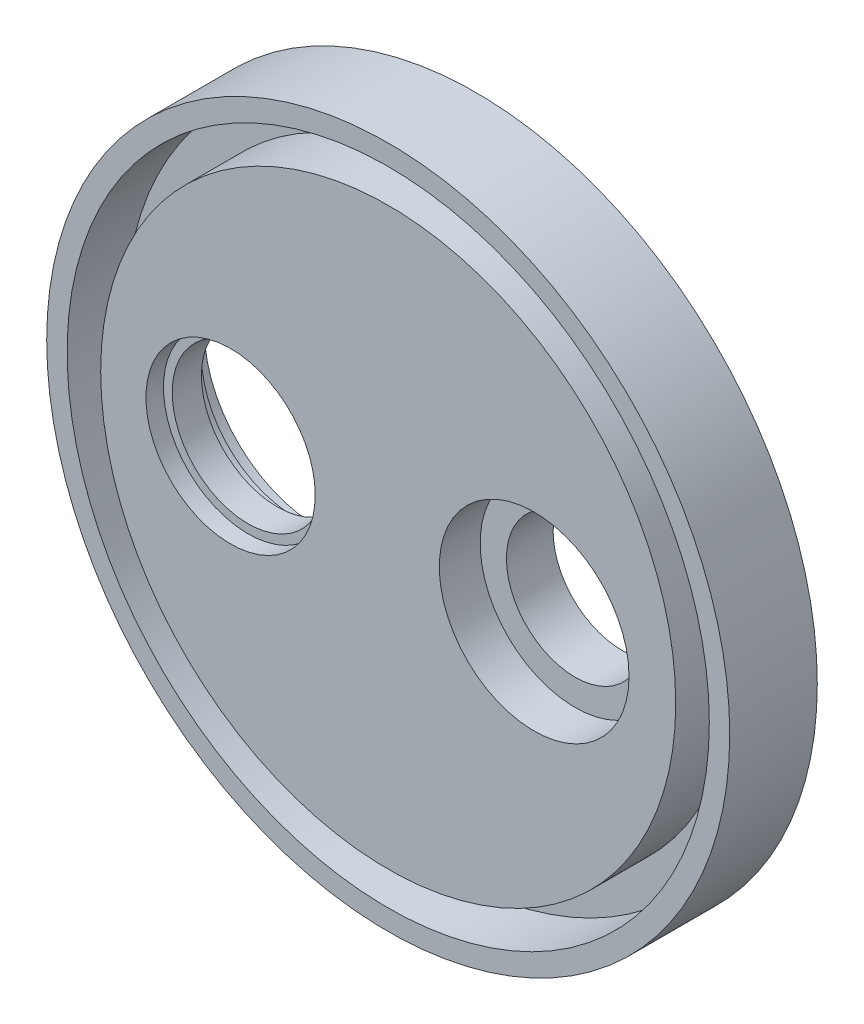
ISO-10303-21;
HEADER;
FILE_DESCRIPTION(('STEP AP214'),'2;1');
FILE_NAME('part.step','',(''),(''),'','','');
FILE_SCHEMA(('AUTOMOTIVE_DESIGN { 1 0 10303 214 1 1 1 1 }'));
ENDSEC;
DATA;
#1=APPLICATION_CONTEXT('core data for automotive mechanical design processes');
#2=APPLICATION_PROTOCOL_DEFINITION('international standard','automotive_design',2000,#1);
#3=PRODUCT_CONTEXT('',#1,'mechanical');
#4=PRODUCT('Part','Part','',(#3));
#5=PRODUCT_RELATED_PRODUCT_CATEGORY('part','',(#4));
#6=PRODUCT_DEFINITION_FORMATION('','',#4);
#7=PRODUCT_DEFINITION_CONTEXT('part definition',#1,'design');
#8=PRODUCT_DEFINITION('design','',#6,#7);
#9=PRODUCT_DEFINITION_SHAPE('','',#8);
#10=(LENGTH_UNIT() NAMED_UNIT(*) SI_UNIT(.MILLI.,.METRE.));
#11=(NAMED_UNIT(*) PLANE_ANGLE_UNIT() SI_UNIT($,.RADIAN.));
#12=(NAMED_UNIT(*) SI_UNIT($,.STERADIAN.) SOLID_ANGLE_UNIT());
#13=UNCERTAINTY_MEASURE_WITH_UNIT(LENGTH_MEASURE(1.E-05),#10,'distance_accuracy_value','');
#14=(GEOMETRIC_REPRESENTATION_CONTEXT(3) GLOBAL_UNCERTAINTY_ASSIGNED_CONTEXT((#13)) GLOBAL_UNIT_ASSIGNED_CONTEXT((#10,
#11,#12)) REPRESENTATION_CONTEXT('',''));
#15=CARTESIAN_POINT('',(0.,0.,0.));
#16=DIRECTION('',(0.,0.,1.));
#17=DIRECTION('',(1.,0.,0.));
#18=AXIS2_PLACEMENT_3D('',#15,#16,#17);
#19=CARTESIAN_POINT('',(25.,0.,15.));
#20=DIRECTION('',(0.,0.,-1.));
#21=DIRECTION('',(-1.,0.,0.));
#22=AXIS2_PLACEMENT_3D('',#19,#20,#21);
#23=CYLINDRICAL_SURFACE('',#22,11.75);
#24=CARTESIAN_POINT('',(25.,0.,0.));
#25=DIRECTION('',(0.,0.,-1.));
#26=DIRECTION('',(-1.,0.,0.));
#27=AXIS2_PLACEMENT_3D('',#24,#25,#26);
#28=CIRCLE('',#27,11.75);
#29=CARTESIAN_POINT('',(13.25,0.,0.));
#30=VERTEX_POINT('',#29);
#31=EDGE_CURVE('E53',#30,#30,#28,.T.);
#32=ORIENTED_EDGE('',*,*,#31,.T.);
#33=EDGE_LOOP('',(#32));
#34=FACE_BOUND('',#33,.T.);
#35=CARTESIAN_POINT('',(25.,0.,8.));
#36=DIRECTION('',(0.,0.,1.));
#37=DIRECTION('',(1.,0.,0.));
#38=AXIS2_PLACEMENT_3D('',#35,#36,#37);
#39=CIRCLE('',#38,11.75);
#40=CARTESIAN_POINT('',(36.75,0.,8.));
#41=VERTEX_POINT('',#40);
#42=EDGE_CURVE('E51',#41,#41,#39,.F.);
#43=ORIENTED_EDGE('',*,*,#42,.F.);
#44=EDGE_LOOP('',(#43));
#45=FACE_BOUND('',#44,.T.);
#46=ADVANCED_FACE('F33',(#34,#45),#23,.F.);
#47=CARTESIAN_POINT('',(0.,0.,15.));
#48=DIRECTION('',(0.,0.,-1.));
#49=DIRECTION('',(-1.,0.,0.));
#50=AXIS2_PLACEMENT_3D('',#47,#48,#49);
#51=CYLINDRICAL_SURFACE('',#50,58.5);
#52=CARTESIAN_POINT('',(0.,0.,15.));
#53=DIRECTION('',(0.,0.,1.));
#54=DIRECTION('',(1.,0.,0.));
#55=AXIS2_PLACEMENT_3D('',#52,#53,#54);
#56=CIRCLE('',#55,58.5);
#57=CARTESIAN_POINT('',(58.5,0.,15.));
#58=VERTEX_POINT('',#57);
#59=EDGE_CURVE('E10',#58,#58,#56,.T.);
#60=ORIENTED_EDGE('',*,*,#59,.F.);
#61=EDGE_LOOP('',(#60));
#62=FACE_BOUND('',#61,.T.);
#63=CARTESIAN_POINT('',(0.,0.,0.));
#64=DIRECTION('',(0.,0.,1.));
#65=DIRECTION('',(1.,0.,0.));
#66=AXIS2_PLACEMENT_3D('',#63,#64,#65);
#67=CIRCLE('',#66,58.5);
#68=CARTESIAN_POINT('',(58.5,0.,0.));
#69=VERTEX_POINT('',#68);
#70=EDGE_CURVE('E41',#69,#69,#67,.T.);
#71=ORIENTED_EDGE('',*,*,#70,.T.);
#72=EDGE_LOOP('',(#71));
#73=FACE_BOUND('',#72,.T.);
#74=ADVANCED_FACE('F35',(#62,#73),#51,.T.);
#75=CARTESIAN_POINT('',(0.,0.,15.));
#76=DIRECTION('',(0.,0.,1.));
#77=DIRECTION('',(1.,0.,0.));
#78=AXIS2_PLACEMENT_3D('',#75,#76,#77);
#79=PLANE('',#78);
#80=CARTESIAN_POINT('',(0.,0.,15.));
#81=DIRECTION('',(0.,0.,1.));
#82=DIRECTION('',(1.,0.,0.));
#83=AXIS2_PLACEMENT_3D('',#80,#81,#82);
#84=CIRCLE('',#83,55.);
#85=CARTESIAN_POINT('',(55.,0.,15.));
#86=VERTEX_POINT('',#85);
#87=EDGE_CURVE('E49',#86,#86,#84,.T.);
#88=ORIENTED_EDGE('',*,*,#87,.F.);
#89=EDGE_LOOP('',(#88));
#90=FACE_BOUND('',#89,.T.);
#91=ORIENTED_EDGE('',*,*,#59,.T.);
#92=EDGE_LOOP('',(#91));
#93=FACE_BOUND('',#92,.T.);
#94=ADVANCED_FACE('F84',(#90,#93),#79,.T.);
#95=CARTESIAN_POINT('',(0.,0.,0.));
#96=DIRECTION('',(0.,0.,1.));
#97=DIRECTION('',(1.,0.,0.));
#98=AXIS2_PLACEMENT_3D('',#95,#96,#97);
#99=PLANE('',#98);
#100=CARTESIAN_POINT('',(-27.,0.,0.));
#101=DIRECTION('',(0.,0.,-1.));
#102=DIRECTION('',(-1.,0.,0.));
#103=AXIS2_PLACEMENT_3D('',#100,#101,#102);
#104=CIRCLE('',#103,19.5);
#105=CARTESIAN_POINT('',(-46.5,0.,0.));
#106=VERTEX_POINT('',#105);
#107=EDGE_CURVE('E69',#106,#106,#104,.T.);
#108=ORIENTED_EDGE('',*,*,#107,.F.);
#109=EDGE_LOOP('',(#108));
#110=FACE_BOUND('',#109,.T.);
#111=ORIENTED_EDGE('',*,*,#31,.F.);
#112=EDGE_LOOP('',(#111));
#113=FACE_BOUND('',#112,.T.);
#114=ORIENTED_EDGE('',*,*,#70,.F.);
#115=EDGE_LOOP('',(#114));
#116=FACE_BOUND('',#115,.T.);
#117=ADVANCED_FACE('F86',(#110,#113,#116),#99,.F.);
#118=CARTESIAN_POINT('',(0.,0.,5.));
#119=DIRECTION('',(0.,0.,1.));
#120=DIRECTION('',(1.,0.,0.));
#121=AXIS2_PLACEMENT_3D('',#118,#119,#120);
#122=CYLINDRICAL_SURFACE('',#121,55.);
#123=CARTESIAN_POINT('',(0.,0.,5.));
#124=DIRECTION('',(0.,0.,1.));
#125=DIRECTION('',(1.,0.,0.));
#126=AXIS2_PLACEMENT_3D('',#123,#124,#125);
#127=CIRCLE('',#126,55.);
#128=CARTESIAN_POINT('',(55.,0.,5.));
#129=VERTEX_POINT('',#128);
#130=EDGE_CURVE('E46',#129,#129,#127,.T.);
#131=ORIENTED_EDGE('',*,*,#130,.F.);
#132=EDGE_LOOP('',(#131));
#133=FACE_BOUND('',#132,.T.);
#134=ORIENTED_EDGE('',*,*,#87,.T.);
#135=EDGE_LOOP('',(#134));
#136=FACE_BOUND('',#135,.T.);
#137=ADVANCED_FACE('F82',(#133,#136),#122,.F.);
#138=CARTESIAN_POINT('',(0.,0.,5.));
#139=DIRECTION('',(0.,0.,1.));
#140=DIRECTION('',(1.,0.,0.));
#141=AXIS2_PLACEMENT_3D('',#138,#139,#140);
#142=PLANE('',#141);
#143=CARTESIAN_POINT('',(0.,0.,5.));
#144=DIRECTION('',(0.,0.,1.));
#145=DIRECTION('',(1.,0.,0.));
#146=AXIS2_PLACEMENT_3D('',#143,#144,#145);
#147=CIRCLE('',#146,49.25);
#148=CARTESIAN_POINT('',(49.25,0.,5.));
#149=VERTEX_POINT('',#148);
#150=EDGE_CURVE('E72',#149,#149,#147,.T.);
#151=ORIENTED_EDGE('',*,*,#150,.F.);
#152=EDGE_LOOP('',(#151));
#153=FACE_BOUND('',#152,.T.);
#154=ORIENTED_EDGE('',*,*,#130,.T.);
#155=EDGE_LOOP('',(#154));
#156=FACE_BOUND('',#155,.T.);
#157=ADVANCED_FACE('F112',(#153,#156),#142,.T.);
#158=CARTESIAN_POINT('',(0.,0.,5.));
#159=DIRECTION('',(0.,0.,1.));
#160=DIRECTION('',(1.,0.,0.));
#161=AXIS2_PLACEMENT_3D('',#158,#159,#160);
#162=CYLINDRICAL_SURFACE('',#161,49.25);
#163=ORIENTED_EDGE('',*,*,#150,.T.);
#164=EDGE_LOOP('',(#163));
#165=FACE_BOUND('',#164,.T.);
#166=CARTESIAN_POINT('',(0.,0.,15.));
#167=DIRECTION('',(0.,0.,1.));
#168=DIRECTION('',(1.,0.,0.));
#169=AXIS2_PLACEMENT_3D('',#166,#167,#168);
#170=CIRCLE('',#169,49.25);
#171=CARTESIAN_POINT('',(49.25,0.,15.));
#172=VERTEX_POINT('',#171);
#173=EDGE_CURVE('E58',#172,#172,#170,.T.);
#174=ORIENTED_EDGE('',*,*,#173,.F.);
#175=EDGE_LOOP('',(#174));
#176=FACE_BOUND('',#175,.T.);
#177=ADVANCED_FACE('F98',(#165,#176),#162,.T.);
#178=CARTESIAN_POINT('',(-27.,0.,15.));
#179=DIRECTION('',(0.,0.,1.));
#180=DIRECTION('',(1.,0.,0.));
#181=AXIS2_PLACEMENT_3D('',#178,#179,#180);
#182=CIRCLE('',#181,14.5);
#183=CARTESIAN_POINT('',(-12.5,0.,15.));
#184=VERTEX_POINT('',#183);
#185=EDGE_CURVE('E254',#184,#184,#182,.T.);
#186=ORIENTED_EDGE('',*,*,#185,.F.);
#187=EDGE_LOOP('',(#186));
#188=FACE_BOUND('',#187,.T.);
#189=CARTESIAN_POINT('',(25.,0.,15.));
#190=DIRECTION('',(0.,0.,1.));
#191=DIRECTION('',(1.,0.,0.));
#192=AXIS2_PLACEMENT_3D('',#189,#190,#191);
#193=CIRCLE('',#192,16.25);
#194=CARTESIAN_POINT('',(41.25,0.,15.));
#195=VERTEX_POINT('',#194);
#196=EDGE_CURVE('E61',#195,#195,#193,.T.);
#197=ORIENTED_EDGE('',*,*,#196,.F.);
#198=EDGE_LOOP('',(#197));
#199=FACE_BOUND('',#198,.T.);
#200=ORIENTED_EDGE('',*,*,#173,.T.);
#201=EDGE_LOOP('',(#200));
#202=FACE_BOUND('',#201,.T.);
#203=ADVANCED_FACE('F88',(#188,#199,#202),#79,.T.);
#204=CARTESIAN_POINT('',(25.,0.,8.));
#205=DIRECTION('',(0.,0.,1.));
#206=DIRECTION('',(1.,0.,0.));
#207=AXIS2_PLACEMENT_3D('',#204,#205,#206);
#208=PLANE('',#207);
#209=CARTESIAN_POINT('',(25.,0.,8.));
#210=DIRECTION('',(0.,0.,1.));
#211=DIRECTION('',(1.,0.,0.));
#212=AXIS2_PLACEMENT_3D('',#209,#210,#211);
#213=CIRCLE('',#212,16.25);
#214=CARTESIAN_POINT('',(41.25,0.,8.));
#215=VERTEX_POINT('',#214);
#216=EDGE_CURVE('E54',#215,#215,#213,.T.);
#217=ORIENTED_EDGE('',*,*,#216,.T.);
#218=EDGE_LOOP('',(#217));
#219=FACE_BOUND('',#218,.T.);
#220=ORIENTED_EDGE('',*,*,#42,.T.);
#221=EDGE_LOOP('',(#220));
#222=FACE_BOUND('',#221,.T.);
#223=ADVANCED_FACE('F97',(#219,#222),#208,.T.);
#224=CARTESIAN_POINT('',(25.,0.,8.));
#225=DIRECTION('',(0.,0.,1.));
#226=DIRECTION('',(1.,0.,0.));
#227=AXIS2_PLACEMENT_3D('',#224,#225,#226);
#228=CYLINDRICAL_SURFACE('',#227,16.25);
#229=ORIENTED_EDGE('',*,*,#216,.F.);
#230=EDGE_LOOP('',(#229));
#231=FACE_BOUND('',#230,.T.);
#232=ORIENTED_EDGE('',*,*,#196,.T.);
#233=EDGE_LOOP('',(#232));
#234=FACE_BOUND('',#233,.T.);
#235=ADVANCED_FACE('F108',(#231,#234),#228,.F.);
#236=CARTESIAN_POINT('',(-27.,0.,4.));
#237=DIRECTION('',(0.,0.,-1.));
#238=DIRECTION('',(-1.,0.,0.));
#239=AXIS2_PLACEMENT_3D('',#236,#237,#238);
#240=CYLINDRICAL_SURFACE('',#239,19.5);
#241=CARTESIAN_POINT('',(-27.,0.,4.));
#242=DIRECTION('',(0.,0.,-1.));
#243=DIRECTION('',(-1.,0.,0.));
#244=AXIS2_PLACEMENT_3D('',#241,#242,#243);
#245=CIRCLE('',#244,19.5);
#246=CARTESIAN_POINT('',(-46.5,0.,4.));
#247=VERTEX_POINT('',#246);
#248=EDGE_CURVE('E66',#247,#247,#245,.T.);
#249=ORIENTED_EDGE('',*,*,#248,.F.);
#250=EDGE_LOOP('',(#249));
#251=FACE_BOUND('',#250,.T.);
#252=ORIENTED_EDGE('',*,*,#107,.T.);
#253=EDGE_LOOP('',(#252));
#254=FACE_BOUND('',#253,.T.);
#255=ADVANCED_FACE('F147',(#251,#254),#240,.F.);
#256=CARTESIAN_POINT('',(-27.,0.,4.));
#257=DIRECTION('',(0.,0.,-1.));
#258=DIRECTION('',(-1.,0.,0.));
#259=AXIS2_PLACEMENT_3D('',#256,#257,#258);
#260=PLANE('',#259);
#261=CARTESIAN_POINT('',(-27.,0.,4.));
#262=DIRECTION('',(0.,0.,-1.));
#263=DIRECTION('',(-1.,0.,0.));
#264=AXIS2_PLACEMENT_3D('',#261,#262,#263);
#265=CIRCLE('',#264,16.);
#266=CARTESIAN_POINT('',(-43.,0.,4.));
#267=VERTEX_POINT('',#266);
#268=EDGE_CURVE('E259',#267,#267,#265,.T.);
#269=ORIENTED_EDGE('',*,*,#268,.F.);
#270=EDGE_LOOP('',(#269));
#271=FACE_BOUND('',#270,.T.);
#272=ORIENTED_EDGE('',*,*,#248,.T.);
#273=EDGE_LOOP('',(#272));
#274=FACE_BOUND('',#273,.T.);
#275=ADVANCED_FACE('F154',(#271,#274),#260,.T.);
#276=CARTESIAN_POINT('',(-27.,0.,7.));
#277=DIRECTION('',(0.,0.,-1.));
#278=DIRECTION('',(-1.,0.,0.));
#279=AXIS2_PLACEMENT_3D('',#276,#277,#278);
#280=CYLINDRICAL_SURFACE('',#279,16.);
#281=CARTESIAN_POINT('',(-27.,0.,7.));
#282=DIRECTION('',(0.,0.,-1.));
#283=DIRECTION('',(-1.,0.,0.));
#284=AXIS2_PLACEMENT_3D('',#281,#282,#283);
#285=CIRCLE('',#284,16.);
#286=CARTESIAN_POINT('',(-43.,0.,7.));
#287=VERTEX_POINT('',#286);
#288=EDGE_CURVE('E262',#287,#287,#285,.T.);
#289=ORIENTED_EDGE('',*,*,#288,.F.);
#290=EDGE_LOOP('',(#289));
#291=FACE_BOUND('',#290,.T.);
#292=ORIENTED_EDGE('',*,*,#268,.T.);
#293=EDGE_LOOP('',(#292));
#294=FACE_BOUND('',#293,.T.);
#295=ADVANCED_FACE('F162',(#291,#294),#280,.F.);
#296=CARTESIAN_POINT('',(-27.,0.,7.));
#297=DIRECTION('',(0.,0.,-1.));
#298=DIRECTION('',(-1.,0.,0.));
#299=AXIS2_PLACEMENT_3D('',#296,#297,#298);
#300=PLANE('',#299);
#301=CARTESIAN_POINT('',(-27.,0.,7.));
#302=DIRECTION('',(0.,0.,-1.));
#303=DIRECTION('',(-1.,0.,0.));
#304=AXIS2_PLACEMENT_3D('',#301,#302,#303);
#305=CIRCLE('',#304,13.);
#306=CARTESIAN_POINT('',(-40.,0.,7.));
#307=VERTEX_POINT('',#306);
#308=EDGE_CURVE('E37',#307,#307,#305,.T.);
#309=ORIENTED_EDGE('',*,*,#308,.F.);
#310=EDGE_LOOP('',(#309));
#311=FACE_BOUND('',#310,.T.);
#312=ORIENTED_EDGE('',*,*,#288,.T.);
#313=EDGE_LOOP('',(#312));
#314=FACE_BOUND('',#313,.T.);
#315=ADVANCED_FACE('F169',(#311,#314),#300,.T.);
#316=CARTESIAN_POINT('',(-27.,0.,12.));
#317=DIRECTION('',(0.,0.,1.));
#318=DIRECTION('',(1.,0.,0.));
#319=AXIS2_PLACEMENT_3D('',#316,#317,#318);
#320=CYLINDRICAL_SURFACE('',#319,14.5);
#321=CARTESIAN_POINT('',(-27.,0.,12.));
#322=DIRECTION('',(0.,0.,1.));
#323=DIRECTION('',(1.,0.,0.));
#324=AXIS2_PLACEMENT_3D('',#321,#322,#323);
#325=CIRCLE('',#324,14.5);
#326=CARTESIAN_POINT('',(-12.5,0.,12.));
#327=VERTEX_POINT('',#326);
#328=EDGE_CURVE('E256',#327,#327,#325,.T.);
#329=ORIENTED_EDGE('',*,*,#328,.F.);
#330=EDGE_LOOP('',(#329));
#331=FACE_BOUND('',#330,.T.);
#332=ORIENTED_EDGE('',*,*,#185,.T.);
#333=EDGE_LOOP('',(#332));
#334=FACE_BOUND('',#333,.T.);
#335=ADVANCED_FACE('F177',(#331,#334),#320,.F.);
#336=CARTESIAN_POINT('',(-27.,0.,12.));
#337=DIRECTION('',(0.,0.,1.));
#338=DIRECTION('',(1.,0.,0.));
#339=AXIS2_PLACEMENT_3D('',#336,#337,#338);
#340=PLANE('',#339);
#341=CARTESIAN_POINT('',(-27.,0.,12.));
#342=DIRECTION('',(0.,0.,1.));
#343=DIRECTION('',(1.,0.,0.));
#344=AXIS2_PLACEMENT_3D('',#341,#342,#343);
#345=CIRCLE('',#344,13.);
#346=CARTESIAN_POINT('',(-14.,0.,12.));
#347=VERTEX_POINT('',#346);
#348=EDGE_CURVE('E252',#347,#347,#345,.T.);
#349=ORIENTED_EDGE('',*,*,#348,.F.);
#350=EDGE_LOOP('',(#349));
#351=FACE_BOUND('',#350,.T.);
#352=ORIENTED_EDGE('',*,*,#328,.T.);
#353=EDGE_LOOP('',(#352));
#354=FACE_BOUND('',#353,.T.);
#355=ADVANCED_FACE('F185',(#351,#354),#340,.T.);
#356=CARTESIAN_POINT('',(-27.,0.,0.));
#357=DIRECTION('',(0.,0.,1.));
#358=DIRECTION('',(1.,0.,0.));
#359=AXIS2_PLACEMENT_3D('',#356,#357,#358);
#360=CYLINDRICAL_SURFACE('',#359,13.);
#361=ORIENTED_EDGE('',*,*,#308,.T.);
#362=EDGE_LOOP('',(#361));
#363=FACE_BOUND('',#362,.T.);
#364=ORIENTED_EDGE('',*,*,#348,.T.);
#365=EDGE_LOOP('',(#364));
#366=FACE_BOUND('',#365,.T.);
#367=ADVANCED_FACE('F192',(#363,#366),#360,.F.);
#368=CLOSED_SHELL('',(#46,#74,#94,#117,#137,#157,#177,#203,#223,#235,#255,#275,#295,#315,#335,
#355,#367));
#369=MANIFOLD_SOLID_BREP('B2',#368);
#370=ADVANCED_BREP_SHAPE_REPRESENTATION('',(#18,#369),#14);
#371=SHAPE_DEFINITION_REPRESENTATION(#9,#370);
ENDSEC;
END-ISO-10303-21;
